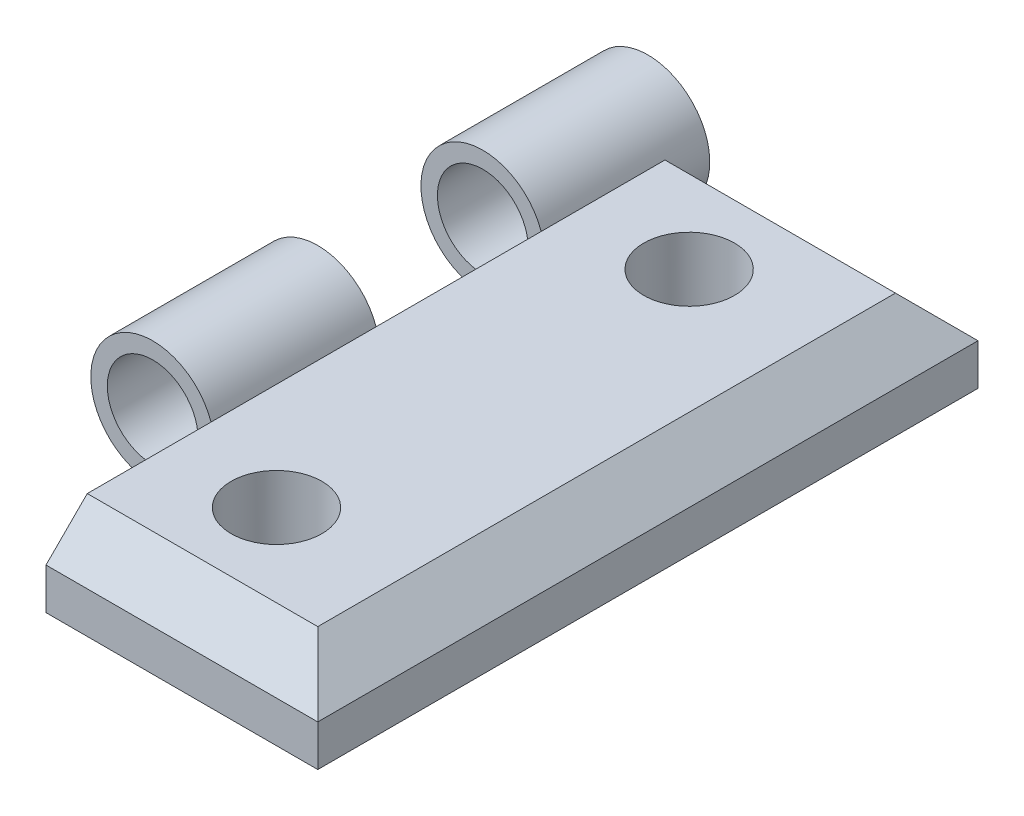
ISO-10303-21;
HEADER;
FILE_DESCRIPTION(('STEP AP214'),'2;1');
FILE_NAME('part.step','',(''),(''),'','','');
FILE_SCHEMA(('AUTOMOTIVE_DESIGN { 1 0 10303 214 1 1 1 1 }'));
ENDSEC;
DATA;
#1=APPLICATION_CONTEXT('core data for automotive mechanical design processes');
#2=APPLICATION_PROTOCOL_DEFINITION('international standard','automotive_design',2000,#1);
#3=PRODUCT_CONTEXT('',#1,'mechanical');
#4=PRODUCT('Part','Part','',(#3));
#5=PRODUCT_RELATED_PRODUCT_CATEGORY('part','',(#4));
#6=PRODUCT_DEFINITION_FORMATION('','',#4);
#7=PRODUCT_DEFINITION_CONTEXT('part definition',#1,'design');
#8=PRODUCT_DEFINITION('design','',#6,#7);
#9=PRODUCT_DEFINITION_SHAPE('','',#8);
#10=(LENGTH_UNIT() NAMED_UNIT(*) SI_UNIT(.MILLI.,.METRE.));
#11=(NAMED_UNIT(*) PLANE_ANGLE_UNIT() SI_UNIT($,.RADIAN.));
#12=(NAMED_UNIT(*) SI_UNIT($,.STERADIAN.) SOLID_ANGLE_UNIT());
#13=UNCERTAINTY_MEASURE_WITH_UNIT(LENGTH_MEASURE(1.E-05),#10,'distance_accuracy_value','');
#14=(GEOMETRIC_REPRESENTATION_CONTEXT(3) GLOBAL_UNCERTAINTY_ASSIGNED_CONTEXT((#13)) GLOBAL_UNIT_ASSIGNED_CONTEXT((#10,
#11,#12)) REPRESENTATION_CONTEXT('',''));
#15=CARTESIAN_POINT('',(0.,0.,0.));
#16=DIRECTION('',(0.,0.,1.));
#17=DIRECTION('',(1.,0.,0.));
#18=AXIS2_PLACEMENT_3D('',#15,#16,#17);
#19=CARTESIAN_POINT('',(-8.84750799774281,3.75,40.));
#20=DIRECTION('',(0.,0.,1.));
#21=DIRECTION('',(1.,0.,0.));
#22=AXIS2_PLACEMENT_3D('',#19,#20,#21);
#23=PLANE('',#22);
#24=DIRECTION('',(0.,1.,0.));
#25=VECTOR('',#24,1.);
#26=CARTESIAN_POINT('',(11.1524920022572,5.,40.));
#27=LINE('',#26,#25);
#28=CARTESIAN_POINT('',(11.1524920022572,0.,40.));
#29=VERTEX_POINT('',#28);
#30=CARTESIAN_POINT('',(11.1524920022572,2.5,40.));
#31=VERTEX_POINT('',#30);
#32=EDGE_CURVE('E203',#29,#31,#27,.T.);
#33=ORIENTED_EDGE('',*,*,#32,.T.);
#34=DIRECTION('',(-1.,0.,0.));
#35=VECTOR('',#34,1.);
#36=CARTESIAN_POINT('',(-5.31197409181007,2.5,40.));
#37=LINE('',#36,#35);
#38=CARTESIAN_POINT('',(-5.31197409181007,2.5,40.));
#39=VERTEX_POINT('',#38);
#40=EDGE_CURVE('E60',#31,#39,#37,.T.);
#41=ORIENTED_EDGE('',*,*,#40,.T.);
#42=DIRECTION('',(0.,-1.,0.));
#43=VECTOR('',#42,1.);
#44=CARTESIAN_POINT('',(-5.31197409181007,40.,40.));
#45=LINE('',#44,#43);
#46=CARTESIAN_POINT('',(-5.31197409181007,0.,40.));
#47=VERTEX_POINT('',#46);
#48=EDGE_CURVE('E139',#39,#47,#45,.T.);
#49=ORIENTED_EDGE('',*,*,#48,.T.);
#50=DIRECTION('',(1.,0.,0.));
#51=VECTOR('',#50,1.);
#52=CARTESIAN_POINT('',(11.1524920022572,0.,40.));
#53=LINE('',#52,#51);
#54=EDGE_CURVE('E154',#47,#29,#53,.T.);
#55=ORIENTED_EDGE('',*,*,#54,.T.);
#56=EDGE_LOOP('',(#33,#41,#49,#55));
#57=FACE_BOUND('',#56,.T.);
#58=ADVANCED_FACE('F41',(#57),#23,.T.);
#59=CARTESIAN_POINT('',(-8.84750799774281,3.75,40.));
#60=DIRECTION('',(0.,0.,-1.));
#61=DIRECTION('',(-1.,0.,0.));
#62=AXIS2_PLACEMENT_3D('',#59,#60,#61);
#63=CYLINDRICAL_SURFACE('',#62,3.75);
#64=CARTESIAN_POINT('',(-8.84750799774281,3.75,20.));
#65=DIRECTION('',(0.,0.,-1.));
#66=DIRECTION('',(-1.,0.,0.));
#67=AXIS2_PLACEMENT_3D('',#64,#65,#66);
#68=CIRCLE('',#67,3.75);
#69=CARTESIAN_POINT('',(-8.84750799774281,0.,20.));
#70=VERTEX_POINT('',#69);
#71=CARTESIAN_POINT('',(-5.31197409181007,5.,20.));
#72=VERTEX_POINT('',#71);
#73=EDGE_CURVE('E190',#70,#72,#68,.T.);
#74=ORIENTED_EDGE('',*,*,#73,.F.);
#75=DIRECTION('',(0.,0.,-1.));
#76=VECTOR('',#75,1.);
#77=CARTESIAN_POINT('',(-8.84750799774281,0.,40.));
#78=LINE('',#77,#76);
#79=CARTESIAN_POINT('',(-8.84750799774281,0.,30.));
#80=VERTEX_POINT('',#79);
#81=EDGE_CURVE('E222',#80,#70,#78,.T.);
#82=ORIENTED_EDGE('',*,*,#81,.F.);
#83=CARTESIAN_POINT('',(-8.84750799774281,3.75,30.));
#84=DIRECTION('',(0.,0.,1.));
#85=DIRECTION('',(1.,0.,0.));
#86=AXIS2_PLACEMENT_3D('',#83,#84,#85);
#87=CIRCLE('',#86,3.75);
#88=CARTESIAN_POINT('',(-5.31197409181007,5.,30.));
#89=VERTEX_POINT('',#88);
#90=EDGE_CURVE('E144',#89,#80,#87,.T.);
#91=ORIENTED_EDGE('',*,*,#90,.F.);
#92=DIRECTION('',(0.,0.,-1.));
#93=VECTOR('',#92,1.);
#94=CARTESIAN_POINT('',(-5.31197409181007,5.,40.));
#95=LINE('',#94,#93);
#96=EDGE_CURVE('E226',#89,#72,#95,.T.);
#97=ORIENTED_EDGE('',*,*,#96,.T.);
#98=EDGE_LOOP('',(#74,#82,#91,#97));
#99=FACE_BOUND('',#98,.T.);
#100=ADVANCED_FACE('F294',(#99),#63,.T.);
#101=CARTESIAN_POINT('',(-8.84750799774281,3.75,9.99999999999999));
#102=DIRECTION('',(0.,0.,1.));
#103=DIRECTION('',(1.,0.,0.));
#104=AXIS2_PLACEMENT_3D('',#101,#102,#103);
#105=CIRCLE('',#104,3.75);
#106=CARTESIAN_POINT('',(-5.31197409181007,5.,10.));
#107=VERTEX_POINT('',#106);
#108=CARTESIAN_POINT('',(-8.84750799774281,0.,10.));
#109=VERTEX_POINT('',#108);
#110=EDGE_CURVE('E186',#107,#109,#105,.T.);
#111=ORIENTED_EDGE('',*,*,#110,.F.);
#112=CARTESIAN_POINT('',(-5.31197409181007,5.,2.5));
#113=VERTEX_POINT('',#112);
#114=EDGE_CURVE('E227',#107,#113,#95,.T.);
#115=ORIENTED_EDGE('',*,*,#114,.T.);
#116=CARTESIAN_POINT('',(-8.84750799774281,3.75,1.24999999999999));
#117=DIRECTION('',(0.,-0.707106781186547,0.707106781186547));
#118=DIRECTION('',(0.,-0.707106781186548,-0.707106781186548));
#119=AXIS2_PLACEMENT_3D('',#116,#117,#118);
#120=ELLIPSE('',#119,5.30330085889911,3.75);
#121=CARTESIAN_POINT('',(-5.31197409181007,2.5,0.));
#122=VERTEX_POINT('',#121);
#123=EDGE_CURVE('E11',#113,#122,#120,.F.);
#124=ORIENTED_EDGE('',*,*,#123,.T.);
#125=CARTESIAN_POINT('',(-8.84750799774281,3.75,0.));
#126=DIRECTION('',(0.,0.,1.));
#127=DIRECTION('',(1.,0.,0.));
#128=AXIS2_PLACEMENT_3D('',#125,#126,#127);
#129=CIRCLE('',#128,3.75);
#130=CARTESIAN_POINT('',(-8.84750799774281,0.,0.));
#131=VERTEX_POINT('',#130);
#132=EDGE_CURVE('E199',#122,#131,#129,.T.);
#133=ORIENTED_EDGE('',*,*,#132,.T.);
#134=EDGE_CURVE('E219',#109,#131,#78,.T.);
#135=ORIENTED_EDGE('',*,*,#134,.F.);
#136=EDGE_LOOP('',(#111,#115,#124,#133,#135));
#137=FACE_BOUND('',#136,.T.);
#138=ADVANCED_FACE('F302',(#137),#63,.T.);
#139=CARTESIAN_POINT('',(-8.84750799774281,3.75,40.));
#140=DIRECTION('',(0.,0.,-1.));
#141=DIRECTION('',(-1.,0.,0.));
#142=AXIS2_PLACEMENT_3D('',#139,#140,#141);
#143=CYLINDRICAL_SURFACE('',#142,2.75);
#144=CARTESIAN_POINT('',(-8.84750799774281,3.75,0.));
#145=DIRECTION('',(0.,0.,1.));
#146=DIRECTION('',(1.,0.,0.));
#147=AXIS2_PLACEMENT_3D('',#144,#145,#146);
#148=CIRCLE('',#147,2.75);
#149=CARTESIAN_POINT('',(-6.09750799774281,3.75,0.));
#150=VERTEX_POINT('',#149);
#151=EDGE_CURVE('E195',#150,#150,#148,.T.);
#152=ORIENTED_EDGE('',*,*,#151,.F.);
#153=EDGE_LOOP('',(#152));
#154=FACE_BOUND('',#153,.T.);
#155=CARTESIAN_POINT('',(-8.84750799774281,3.75,9.99999999999999));
#156=DIRECTION('',(0.,0.,1.));
#157=DIRECTION('',(1.,0.,0.));
#158=AXIS2_PLACEMENT_3D('',#155,#156,#157);
#159=CIRCLE('',#158,2.75);
#160=CARTESIAN_POINT('',(-6.09750799774281,3.75,9.99999999999999));
#161=VERTEX_POINT('',#160);
#162=EDGE_CURVE('E185',#161,#161,#159,.T.);
#163=ORIENTED_EDGE('',*,*,#162,.T.);
#164=EDGE_LOOP('',(#163));
#165=FACE_BOUND('',#164,.T.);
#166=ADVANCED_FACE('F321',(#154,#165),#143,.F.);
#167=CARTESIAN_POINT('',(-8.84750799774281,3.75,0.));
#168=DIRECTION('',(0.,0.,1.));
#169=DIRECTION('',(1.,0.,0.));
#170=AXIS2_PLACEMENT_3D('',#167,#168,#169);
#171=PLANE('',#170);
#172=ORIENTED_EDGE('',*,*,#132,.F.);
#173=DIRECTION('',(1.,0.,0.));
#174=VECTOR('',#173,1.);
#175=CARTESIAN_POINT('',(-8.84750799774281,2.5,0.));
#176=LINE('',#175,#174);
#177=CARTESIAN_POINT('',(11.1524920022572,2.5,0.));
#178=VERTEX_POINT('',#177);
#179=EDGE_CURVE('E252',#122,#178,#176,.T.);
#180=ORIENTED_EDGE('',*,*,#179,.T.);
#181=DIRECTION('',(0.,1.,0.));
#182=VECTOR('',#181,1.);
#183=CARTESIAN_POINT('',(11.1524920022572,5.,0.));
#184=LINE('',#183,#182);
#185=CARTESIAN_POINT('',(11.1524920022572,0.,0.));
#186=VERTEX_POINT('',#185);
#187=EDGE_CURVE('E204',#186,#178,#184,.T.);
#188=ORIENTED_EDGE('',*,*,#187,.F.);
#189=DIRECTION('',(1.,0.,0.));
#190=VECTOR('',#189,1.);
#191=CARTESIAN_POINT('',(11.1524920022572,0.,0.));
#192=LINE('',#191,#190);
#193=EDGE_CURVE('E211',#131,#186,#192,.T.);
#194=ORIENTED_EDGE('',*,*,#193,.F.);
#195=EDGE_LOOP('',(#172,#180,#188,#194));
#196=FACE_BOUND('',#195,.T.);
#197=ORIENTED_EDGE('',*,*,#151,.T.);
#198=EDGE_LOOP('',(#197));
#199=FACE_BOUND('',#198,.T.);
#200=ADVANCED_FACE('F306',(#196,#199),#171,.F.);
#201=CARTESIAN_POINT('',(11.1524920022572,0.,40.));
#202=DIRECTION('',(0.,1.,0.));
#203=DIRECTION('',(-1.,0.,0.));
#204=AXIS2_PLACEMENT_3D('',#201,#202,#203);
#205=PLANE('',#204);
#206=DIRECTION('',(1.,0.,0.));
#207=VECTOR('',#206,1.);
#208=CARTESIAN_POINT('',(-5.31197409181007,0.,20.));
#209=LINE('',#208,#207);
#210=CARTESIAN_POINT('',(-5.31197409181007,0.,20.));
#211=VERTEX_POINT('',#210);
#212=EDGE_CURVE('E165',#70,#211,#209,.T.);
#213=ORIENTED_EDGE('',*,*,#212,.T.);
#214=DIRECTION('',(0.,0.,-1.));
#215=VECTOR('',#214,1.);
#216=CARTESIAN_POINT('',(-5.31197409181007,0.,10.));
#217=LINE('',#216,#215);
#218=CARTESIAN_POINT('',(-5.31197409181007,0.,10.));
#219=VERTEX_POINT('',#218);
#220=EDGE_CURVE('E168',#211,#219,#217,.T.);
#221=ORIENTED_EDGE('',*,*,#220,.T.);
#222=DIRECTION('',(-1.,0.,0.));
#223=VECTOR('',#222,1.);
#224=CARTESIAN_POINT('',(-12.5975079977428,0.,10.));
#225=LINE('',#224,#223);
#226=EDGE_CURVE('E172',#219,#109,#225,.T.);
#227=ORIENTED_EDGE('',*,*,#226,.T.);
#228=ORIENTED_EDGE('',*,*,#134,.T.);
#229=ORIENTED_EDGE('',*,*,#193,.T.);
#230=DIRECTION('',(0.,0.,-1.));
#231=VECTOR('',#230,1.);
#232=CARTESIAN_POINT('',(11.1524920022572,0.,40.));
#233=LINE('',#232,#231);
#234=EDGE_CURVE('E207',#29,#186,#233,.T.);
#235=ORIENTED_EDGE('',*,*,#234,.F.);
#236=ORIENTED_EDGE('',*,*,#54,.F.);
#237=DIRECTION('',(0.,0.,-1.));
#238=VECTOR('',#237,1.);
#239=CARTESIAN_POINT('',(-5.31197409181007,0.,30.));
#240=LINE('',#239,#238);
#241=CARTESIAN_POINT('',(-5.31197409181007,0.,30.));
#242=VERTEX_POINT('',#241);
#243=EDGE_CURVE('E131',#47,#242,#240,.T.);
#244=ORIENTED_EDGE('',*,*,#243,.T.);
#245=DIRECTION('',(-1.,0.,0.));
#246=VECTOR('',#245,1.);
#247=CARTESIAN_POINT('',(-12.5975079977428,0.,30.));
#248=LINE('',#247,#246);
#249=EDGE_CURVE('E142',#242,#80,#248,.T.);
#250=ORIENTED_EDGE('',*,*,#249,.T.);
#251=ORIENTED_EDGE('',*,*,#81,.T.);
#252=EDGE_LOOP('',(#213,#221,#227,#228,#229,#235,#236,#244,#250,#251));
#253=FACE_BOUND('',#252,.T.);
#254=CARTESIAN_POINT('',(1.15249200225719,0.,32.5));
#255=DIRECTION('',(0.,1.,0.));
#256=DIRECTION('',(0.,0.,1.));
#257=AXIS2_PLACEMENT_3D('',#254,#255,#256);
#258=CIRCLE('',#257,2.75);
#259=CARTESIAN_POINT('',(1.15249200225719,0.,35.25));
#260=VERTEX_POINT('',#259);
#261=EDGE_CURVE('E138',#260,#260,#258,.T.);
#262=ORIENTED_EDGE('',*,*,#261,.T.);
#263=EDGE_LOOP('',(#262));
#264=FACE_BOUND('',#263,.T.);
#265=CARTESIAN_POINT('',(1.15249200225719,0.,7.5));
#266=DIRECTION('',(0.,1.,0.));
#267=DIRECTION('',(0.,0.,1.));
#268=AXIS2_PLACEMENT_3D('',#265,#266,#267);
#269=CIRCLE('',#268,2.75);
#270=CARTESIAN_POINT('',(1.15249200225719,0.,10.25));
#271=VERTEX_POINT('',#270);
#272=EDGE_CURVE('E178',#271,#271,#269,.T.);
#273=ORIENTED_EDGE('',*,*,#272,.T.);
#274=EDGE_LOOP('',(#273));
#275=FACE_BOUND('',#274,.T.);
#276=ADVANCED_FACE('F151',(#253,#264,#275),#205,.F.);
#277=CARTESIAN_POINT('',(11.1524920022572,5.,40.));
#278=DIRECTION('',(-1.,0.,0.));
#279=DIRECTION('',(0.,0.,1.));
#280=AXIS2_PLACEMENT_3D('',#277,#278,#279);
#281=PLANE('',#280);
#282=ORIENTED_EDGE('',*,*,#187,.T.);
#283=DIRECTION('',(0.,0.,1.));
#284=VECTOR('',#283,1.);
#285=CARTESIAN_POINT('',(11.1524920022572,2.5,40.));
#286=LINE('',#285,#284);
#287=EDGE_CURVE('E68',#178,#31,#286,.T.);
#288=ORIENTED_EDGE('',*,*,#287,.T.);
#289=ORIENTED_EDGE('',*,*,#32,.F.);
#290=ORIENTED_EDGE('',*,*,#234,.T.);
#291=EDGE_LOOP('',(#282,#288,#289,#290));
#292=FACE_BOUND('',#291,.T.);
#293=ADVANCED_FACE('F308',(#292),#281,.F.);
#294=CARTESIAN_POINT('',(-4.54577540282589,5.,40.));
#295=DIRECTION('',(0.,-1.,0.));
#296=DIRECTION('',(0.,0.,-1.));
#297=AXIS2_PLACEMENT_3D('',#294,#295,#296);
#298=PLANE('',#297);
#299=CARTESIAN_POINT('',(1.15249200225719,5.,32.5));
#300=DIRECTION('',(0.,-1.,0.));
#301=DIRECTION('',(0.,0.,-1.));
#302=AXIS2_PLACEMENT_3D('',#299,#300,#301);
#303=CIRCLE('',#302,2.75);
#304=CARTESIAN_POINT('',(1.15249200225719,5.,29.75));
#305=VERTEX_POINT('',#304);
#306=EDGE_CURVE('E200',#305,#305,#303,.F.);
#307=ORIENTED_EDGE('',*,*,#306,.F.);
#308=EDGE_LOOP('',(#307));
#309=FACE_BOUND('',#308,.T.);
#310=CARTESIAN_POINT('',(1.15249200225719,5.,7.5));
#311=DIRECTION('',(0.,-1.,0.));
#312=DIRECTION('',(0.,0.,-1.));
#313=AXIS2_PLACEMENT_3D('',#310,#311,#312);
#314=CIRCLE('',#313,2.75);
#315=CARTESIAN_POINT('',(1.15249200225719,5.,4.75));
#316=VERTEX_POINT('',#315);
#317=EDGE_CURVE('E194',#316,#316,#314,.F.);
#318=ORIENTED_EDGE('',*,*,#317,.F.);
#319=EDGE_LOOP('',(#318));
#320=FACE_BOUND('',#319,.T.);
#321=DIRECTION('',(0.,0.,-1.));
#322=VECTOR('',#321,1.);
#323=CARTESIAN_POINT('',(8.65249200225719,5.,40.));
#324=LINE('',#323,#322);
#325=CARTESIAN_POINT('',(8.65249200225719,5.,37.5));
#326=VERTEX_POINT('',#325);
#327=CARTESIAN_POINT('',(8.65249200225719,5.,2.5));
#328=VERTEX_POINT('',#327);
#329=EDGE_CURVE('E245',#326,#328,#324,.T.);
#330=ORIENTED_EDGE('',*,*,#329,.T.);
#331=DIRECTION('',(-1.,0.,0.));
#332=VECTOR('',#331,1.);
#333=CARTESIAN_POINT('',(-4.54577540282589,5.,2.5));
#334=LINE('',#333,#332);
#335=EDGE_CURVE('E248',#328,#113,#334,.T.);
#336=ORIENTED_EDGE('',*,*,#335,.T.);
#337=ORIENTED_EDGE('',*,*,#114,.F.);
#338=EDGE_CURVE('E282',#72,#107,#95,.T.);
#339=ORIENTED_EDGE('',*,*,#338,.F.);
#340=ORIENTED_EDGE('',*,*,#96,.F.);
#341=CARTESIAN_POINT('',(-5.31197409181007,5.,37.5));
#342=VERTEX_POINT('',#341);
#343=EDGE_CURVE('E134',#342,#89,#95,.T.);
#344=ORIENTED_EDGE('',*,*,#343,.F.);
#345=DIRECTION('',(1.,0.,0.));
#346=VECTOR('',#345,1.);
#347=CARTESIAN_POINT('',(11.1524920022572,5.,37.5));
#348=LINE('',#347,#346);
#349=EDGE_CURVE('E225',#342,#326,#348,.T.);
#350=ORIENTED_EDGE('',*,*,#349,.T.);
#351=EDGE_LOOP('',(#330,#336,#337,#339,#340,#344,#350));
#352=FACE_BOUND('',#351,.T.);
#353=ADVANCED_FACE('F278',(#309,#320,#352),#298,.F.);
#354=CARTESIAN_POINT('',(-5.31197409181007,40.,30.));
#355=DIRECTION('',(-1.,0.,0.));
#356=DIRECTION('',(0.,0.,1.));
#357=AXIS2_PLACEMENT_3D('',#354,#355,#356);
#358=PLANE('',#357);
#359=ORIENTED_EDGE('',*,*,#48,.F.);
#360=DIRECTION('',(0.,0.707106781186548,-0.707106781186548));
#361=VECTOR('',#360,1.);
#362=CARTESIAN_POINT('',(-5.31197409181007,26.25,16.25));
#363=LINE('',#362,#361);
#364=EDGE_CURVE('E52',#39,#342,#363,.T.);
#365=ORIENTED_EDGE('',*,*,#364,.T.);
#366=ORIENTED_EDGE('',*,*,#343,.T.);
#367=DIRECTION('',(0.,-1.,0.));
#368=VECTOR('',#367,1.);
#369=CARTESIAN_POINT('',(-5.31197409181007,40.,30.));
#370=LINE('',#369,#368);
#371=EDGE_CURVE('E127',#89,#242,#370,.T.);
#372=ORIENTED_EDGE('',*,*,#371,.T.);
#373=ORIENTED_EDGE('',*,*,#243,.F.);
#374=EDGE_LOOP('',(#359,#365,#366,#372,#373));
#375=FACE_BOUND('',#374,.T.);
#376=ADVANCED_FACE('F129',(#375),#358,.T.);
#377=CARTESIAN_POINT('',(-12.5975079977428,40.,30.));
#378=DIRECTION('',(0.,0.,1.));
#379=DIRECTION('',(1.,0.,0.));
#380=AXIS2_PLACEMENT_3D('',#377,#378,#379);
#381=PLANE('',#380);
#382=CARTESIAN_POINT('',(-8.84750799774281,3.75,30.));
#383=DIRECTION('',(0.,0.,1.));
#384=DIRECTION('',(1.,0.,0.));
#385=AXIS2_PLACEMENT_3D('',#382,#383,#384);
#386=CIRCLE('',#385,2.75);
#387=CARTESIAN_POINT('',(-6.09750799774281,3.75,30.));
#388=VERTEX_POINT('',#387);
#389=EDGE_CURVE('E182',#388,#388,#386,.T.);
#390=ORIENTED_EDGE('',*,*,#389,.F.);
#391=EDGE_LOOP('',(#390));
#392=FACE_BOUND('',#391,.T.);
#393=ORIENTED_EDGE('',*,*,#90,.T.);
#394=ORIENTED_EDGE('',*,*,#249,.F.);
#395=ORIENTED_EDGE('',*,*,#371,.F.);
#396=EDGE_LOOP('',(#393,#394,#395));
#397=FACE_BOUND('',#396,.T.);
#398=ADVANCED_FACE('F143',(#392,#397),#381,.T.);
#399=CARTESIAN_POINT('',(-5.31197409181007,40.,10.));
#400=DIRECTION('',(-1.,0.,0.));
#401=DIRECTION('',(0.,0.,1.));
#402=AXIS2_PLACEMENT_3D('',#399,#400,#401);
#403=PLANE('',#402);
#404=ORIENTED_EDGE('',*,*,#338,.T.);
#405=DIRECTION('',(0.,-1.,0.));
#406=VECTOR('',#405,1.);
#407=CARTESIAN_POINT('',(-5.31197409181007,40.,10.));
#408=LINE('',#407,#406);
#409=EDGE_CURVE('E159',#107,#219,#408,.T.);
#410=ORIENTED_EDGE('',*,*,#409,.T.);
#411=ORIENTED_EDGE('',*,*,#220,.F.);
#412=DIRECTION('',(0.,-1.,0.));
#413=VECTOR('',#412,1.);
#414=CARTESIAN_POINT('',(-5.31197409181007,40.,20.));
#415=LINE('',#414,#413);
#416=EDGE_CURVE('E156',#72,#211,#415,.T.);
#417=ORIENTED_EDGE('',*,*,#416,.F.);
#418=EDGE_LOOP('',(#404,#410,#411,#417));
#419=FACE_BOUND('',#418,.T.);
#420=ADVANCED_FACE('F298',(#419),#403,.T.);
#421=CARTESIAN_POINT('',(-5.31197409181007,40.,20.));
#422=DIRECTION('',(0.,0.,-1.));
#423=DIRECTION('',(-1.,0.,0.));
#424=AXIS2_PLACEMENT_3D('',#421,#422,#423);
#425=PLANE('',#424);
#426=CARTESIAN_POINT('',(-8.84750799774281,3.75,20.));
#427=DIRECTION('',(0.,0.,-1.));
#428=DIRECTION('',(-1.,0.,0.));
#429=AXIS2_PLACEMENT_3D('',#426,#427,#428);
#430=CIRCLE('',#429,2.75);
#431=CARTESIAN_POINT('',(-11.5975079977428,3.75,20.));
#432=VERTEX_POINT('',#431);
#433=EDGE_CURVE('E189',#432,#432,#430,.T.);
#434=ORIENTED_EDGE('',*,*,#433,.F.);
#435=EDGE_LOOP('',(#434));
#436=FACE_BOUND('',#435,.T.);
#437=ORIENTED_EDGE('',*,*,#73,.T.);
#438=ORIENTED_EDGE('',*,*,#416,.T.);
#439=ORIENTED_EDGE('',*,*,#212,.F.);
#440=EDGE_LOOP('',(#437,#438,#439));
#441=FACE_BOUND('',#440,.T.);
#442=ADVANCED_FACE('F296',(#436,#441),#425,.T.);
#443=CARTESIAN_POINT('',(-12.5975079977428,40.,10.));
#444=DIRECTION('',(0.,0.,1.));
#445=DIRECTION('',(1.,0.,0.));
#446=AXIS2_PLACEMENT_3D('',#443,#444,#445);
#447=PLANE('',#446);
#448=ORIENTED_EDGE('',*,*,#162,.F.);
#449=EDGE_LOOP('',(#448));
#450=FACE_BOUND('',#449,.T.);
#451=ORIENTED_EDGE('',*,*,#110,.T.);
#452=ORIENTED_EDGE('',*,*,#226,.F.);
#453=ORIENTED_EDGE('',*,*,#409,.F.);
#454=EDGE_LOOP('',(#451,#452,#453));
#455=FACE_BOUND('',#454,.T.);
#456=ADVANCED_FACE('F362',(#450,#455),#447,.T.);
#457=CARTESIAN_POINT('',(1.15249200225719,40.,7.5));
#458=DIRECTION('',(0.,-1.,0.));
#459=DIRECTION('',(0.,0.,-1.));
#460=AXIS2_PLACEMENT_3D('',#457,#458,#459);
#461=CYLINDRICAL_SURFACE('',#460,2.75);
#462=ORIENTED_EDGE('',*,*,#272,.F.);
#463=EDGE_LOOP('',(#462));
#464=FACE_BOUND('',#463,.T.);
#465=ORIENTED_EDGE('',*,*,#317,.T.);
#466=EDGE_LOOP('',(#465));
#467=FACE_BOUND('',#466,.T.);
#468=ADVANCED_FACE('F349',(#464,#467),#461,.F.);
#469=CARTESIAN_POINT('',(1.15249200225719,40.,32.5));
#470=DIRECTION('',(0.,-1.,0.));
#471=DIRECTION('',(0.,0.,-1.));
#472=AXIS2_PLACEMENT_3D('',#469,#470,#471);
#473=CYLINDRICAL_SURFACE('',#472,2.75);
#474=ORIENTED_EDGE('',*,*,#261,.F.);
#475=EDGE_LOOP('',(#474));
#476=FACE_BOUND('',#475,.T.);
#477=ORIENTED_EDGE('',*,*,#306,.T.);
#478=EDGE_LOOP('',(#477));
#479=FACE_BOUND('',#478,.T.);
#480=ADVANCED_FACE('F344',(#476,#479),#473,.F.);
#481=ORIENTED_EDGE('',*,*,#389,.T.);
#482=EDGE_LOOP('',(#481));
#483=FACE_BOUND('',#482,.T.);
#484=ORIENTED_EDGE('',*,*,#433,.T.);
#485=EDGE_LOOP('',(#484));
#486=FACE_BOUND('',#485,.T.);
#487=ADVANCED_FACE('F317',(#483,#486),#143,.F.);
#488=CARTESIAN_POINT('',(-8.84750799774281,2.5,40.));
#489=DIRECTION('',(0.,0.707106781186547,0.707106781186547));
#490=DIRECTION('',(1.,0.,0.));
#491=AXIS2_PLACEMENT_3D('',#488,#489,#490);
#492=PLANE('',#491);
#493=ORIENTED_EDGE('',*,*,#364,.F.);
#494=ORIENTED_EDGE('',*,*,#40,.F.);
#495=DIRECTION('',(0.577350269189626,-0.577350269189626,0.577350269189626));
#496=VECTOR('',#495,1.);
#497=CARTESIAN_POINT('',(4.48582533559052,9.16666666666667,33.3333333333333));
#498=LINE('',#497,#496);
#499=EDGE_CURVE('E46',#326,#31,#498,.T.);
#500=ORIENTED_EDGE('',*,*,#499,.F.);
#501=ORIENTED_EDGE('',*,*,#349,.F.);
#502=EDGE_LOOP('',(#493,#494,#500,#501));
#503=FACE_BOUND('',#502,.T.);
#504=ADVANCED_FACE('F44',(#503),#492,.T.);
#505=CARTESIAN_POINT('',(8.65249200225719,5.,40.));
#506=DIRECTION('',(-0.707106781186547,-0.707106781186547,0.));
#507=DIRECTION('',(0.,0.,-1.));
#508=AXIS2_PLACEMENT_3D('',#505,#506,#507);
#509=PLANE('',#508);
#510=ORIENTED_EDGE('',*,*,#499,.T.);
#511=ORIENTED_EDGE('',*,*,#287,.F.);
#512=DIRECTION('',(-0.577350269189626,0.577350269189626,0.577350269189626));
#513=VECTOR('',#512,1.);
#514=CARTESIAN_POINT('',(-3.84750799774281,17.5,15.));
#515=LINE('',#514,#513);
#516=EDGE_CURVE('E260',#328,#178,#515,.F.);
#517=ORIENTED_EDGE('',*,*,#516,.F.);
#518=ORIENTED_EDGE('',*,*,#329,.F.);
#519=EDGE_LOOP('',(#510,#511,#517,#518));
#520=FACE_BOUND('',#519,.T.);
#521=ADVANCED_FACE('F272',(#520),#509,.F.);
#522=CARTESIAN_POINT('',(-4.54577540282589,5.,2.5));
#523=DIRECTION('',(0.,-0.707106781186547,0.707106781186547));
#524=DIRECTION('',(-1.,0.,0.));
#525=AXIS2_PLACEMENT_3D('',#522,#523,#524);
#526=PLANE('',#525);
#527=ORIENTED_EDGE('',*,*,#516,.T.);
#528=ORIENTED_EDGE('',*,*,#179,.F.);
#529=ORIENTED_EDGE('',*,*,#123,.F.);
#530=ORIENTED_EDGE('',*,*,#335,.F.);
#531=EDGE_LOOP('',(#527,#528,#529,#530));
#532=FACE_BOUND('',#531,.T.);
#533=ADVANCED_FACE('F330',(#532),#526,.F.);
#534=CLOSED_SHELL('',(#58,#100,#138,#166,#200,#276,#293,#353,#376,#398,#420,#442,#456,#468,#480,
#487,#504,#521,#533));
#535=MANIFOLD_SOLID_BREP('B2',#534);
#536=ADVANCED_BREP_SHAPE_REPRESENTATION('',(#18,#535),#14);
#537=SHAPE_DEFINITION_REPRESENTATION(#9,#536);
ENDSEC;
END-ISO-10303-21;
